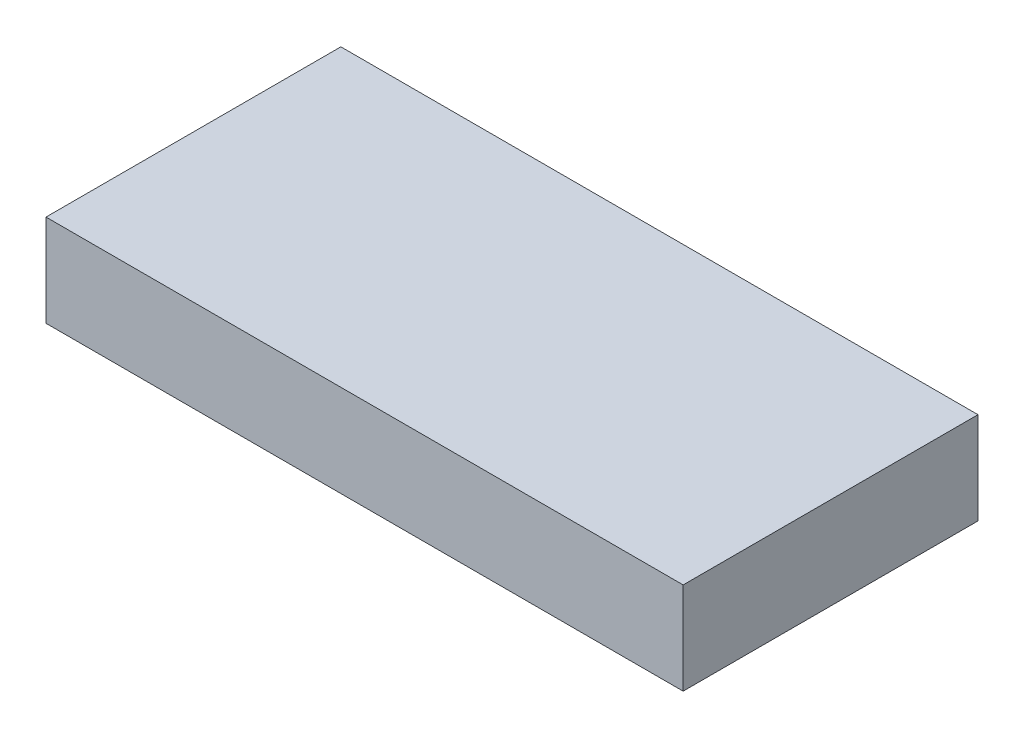
ISO-10303-21;
HEADER;
FILE_DESCRIPTION(('STEP AP214'),'2;1');
FILE_NAME('part.step','',(''),(''),'','','');
FILE_SCHEMA(('AUTOMOTIVE_DESIGN { 1 0 10303 214 1 1 1 1 }'));
ENDSEC;
DATA;
#1=APPLICATION_CONTEXT('core data for automotive mechanical design processes');
#2=APPLICATION_PROTOCOL_DEFINITION('international standard','automotive_design',2000,#1);
#3=PRODUCT_CONTEXT('',#1,'mechanical');
#4=PRODUCT('Part','Part','',(#3));
#5=PRODUCT_RELATED_PRODUCT_CATEGORY('part','',(#4));
#6=PRODUCT_DEFINITION_FORMATION('','',#4);
#7=PRODUCT_DEFINITION_CONTEXT('part definition',#1,'design');
#8=PRODUCT_DEFINITION('design','',#6,#7);
#9=PRODUCT_DEFINITION_SHAPE('','',#8);
#10=(LENGTH_UNIT() NAMED_UNIT(*) SI_UNIT(.MILLI.,.METRE.));
#11=(NAMED_UNIT(*) PLANE_ANGLE_UNIT() SI_UNIT($,.RADIAN.));
#12=(NAMED_UNIT(*) SI_UNIT($,.STERADIAN.) SOLID_ANGLE_UNIT());
#13=UNCERTAINTY_MEASURE_WITH_UNIT(LENGTH_MEASURE(1.E-05),#10,'distance_accuracy_value','');
#14=(GEOMETRIC_REPRESENTATION_CONTEXT(3) GLOBAL_UNCERTAINTY_ASSIGNED_CONTEXT((#13)) GLOBAL_UNIT_ASSIGNED_CONTEXT((#10,
#11,#12)) REPRESENTATION_CONTEXT('',''));
#15=CARTESIAN_POINT('',(0.,0.,0.));
#16=DIRECTION('',(0.,0.,1.));
#17=DIRECTION('',(1.,0.,0.));
#18=AXIS2_PLACEMENT_3D('',#15,#16,#17);
#19=CARTESIAN_POINT('',(0.,260.,0.));
#20=DIRECTION('',(1.,0.,0.));
#21=DIRECTION('',(0.,0.,-1.));
#22=AXIS2_PLACEMENT_3D('',#19,#20,#21);
#23=PLANE('',#22);
#24=DIRECTION('',(0.,0.,1.));
#25=VECTOR('',#24,1.);
#26=CARTESIAN_POINT('',(0.,0.,0.));
#27=LINE('',#26,#25);
#28=CARTESIAN_POINT('',(0.,0.,-833.));
#29=VERTEX_POINT('',#28);
#30=CARTESIAN_POINT('',(0.,0.,0.));
#31=VERTEX_POINT('',#30);
#32=EDGE_CURVE('E111',#29,#31,#27,.T.);
#33=ORIENTED_EDGE('',*,*,#32,.T.);
#34=DIRECTION('',(0.,-1.,0.));
#35=VECTOR('',#34,1.);
#36=CARTESIAN_POINT('',(0.,260.,0.));
#37=LINE('',#36,#35);
#38=CARTESIAN_POINT('',(0.,260.,0.));
#39=VERTEX_POINT('',#38);
#40=EDGE_CURVE('E11',#39,#31,#37,.T.);
#41=ORIENTED_EDGE('',*,*,#40,.F.);
#42=DIRECTION('',(0.,0.,1.));
#43=VECTOR('',#42,1.);
#44=CARTESIAN_POINT('',(0.,260.,0.));
#45=LINE('',#44,#43);
#46=CARTESIAN_POINT('',(0.,260.,-833.));
#47=VERTEX_POINT('',#46);
#48=EDGE_CURVE('E95',#47,#39,#45,.T.);
#49=ORIENTED_EDGE('',*,*,#48,.F.);
#50=DIRECTION('',(0.,-1.,0.));
#51=VECTOR('',#50,1.);
#52=CARTESIAN_POINT('',(0.,260.,-833.));
#53=LINE('',#52,#51);
#54=EDGE_CURVE('E107',#47,#29,#53,.T.);
#55=ORIENTED_EDGE('',*,*,#54,.T.);
#56=EDGE_LOOP('',(#33,#41,#49,#55));
#57=FACE_BOUND('',#56,.T.);
#58=ADVANCED_FACE('F43',(#57),#23,.F.);
#59=CARTESIAN_POINT('',(0.,260.,0.));
#60=DIRECTION('',(0.,0.,-1.));
#61=DIRECTION('',(-1.,0.,0.));
#62=AXIS2_PLACEMENT_3D('',#59,#60,#61);
#63=PLANE('',#62);
#64=DIRECTION('',(1.,0.,0.));
#65=VECTOR('',#64,1.);
#66=CARTESIAN_POINT('',(0.,0.,0.));
#67=LINE('',#66,#65);
#68=CARTESIAN_POINT('',(1800.,0.,0.));
#69=VERTEX_POINT('',#68);
#70=EDGE_CURVE('E100',#31,#69,#67,.T.);
#71=ORIENTED_EDGE('',*,*,#70,.T.);
#72=DIRECTION('',(0.,-1.,0.));
#73=VECTOR('',#72,1.);
#74=CARTESIAN_POINT('',(1800.,260.,0.));
#75=LINE('',#74,#73);
#76=CARTESIAN_POINT('',(1800.,260.,0.));
#77=VERTEX_POINT('',#76);
#78=EDGE_CURVE('E52',#77,#69,#75,.T.);
#79=ORIENTED_EDGE('',*,*,#78,.F.);
#80=DIRECTION('',(1.,0.,0.));
#81=VECTOR('',#80,1.);
#82=CARTESIAN_POINT('',(0.,260.,0.));
#83=LINE('',#82,#81);
#84=EDGE_CURVE('E90',#39,#77,#83,.T.);
#85=ORIENTED_EDGE('',*,*,#84,.F.);
#86=ORIENTED_EDGE('',*,*,#40,.T.);
#87=EDGE_LOOP('',(#71,#79,#85,#86));
#88=FACE_BOUND('',#87,.T.);
#89=ADVANCED_FACE('F99',(#88),#63,.F.);
#90=CARTESIAN_POINT('',(1800.,260.,0.));
#91=DIRECTION('',(-1.,0.,0.));
#92=DIRECTION('',(0.,0.,1.));
#93=AXIS2_PLACEMENT_3D('',#90,#91,#92);
#94=PLANE('',#93);
#95=DIRECTION('',(0.,0.,-1.));
#96=VECTOR('',#95,1.);
#97=CARTESIAN_POINT('',(1800.,0.,0.));
#98=LINE('',#97,#96);
#99=CARTESIAN_POINT('',(1800.,0.,-833.));
#100=VERTEX_POINT('',#99);
#101=EDGE_CURVE('E77',#69,#100,#98,.T.);
#102=ORIENTED_EDGE('',*,*,#101,.T.);
#103=DIRECTION('',(0.,-1.,0.));
#104=VECTOR('',#103,1.);
#105=CARTESIAN_POINT('',(1800.,260.,-833.));
#106=LINE('',#105,#104);
#107=CARTESIAN_POINT('',(1800.,260.,-833.));
#108=VERTEX_POINT('',#107);
#109=EDGE_CURVE('E102',#108,#100,#106,.T.);
#110=ORIENTED_EDGE('',*,*,#109,.F.);
#111=DIRECTION('',(0.,0.,-1.));
#112=VECTOR('',#111,1.);
#113=CARTESIAN_POINT('',(1800.,260.,0.));
#114=LINE('',#113,#112);
#115=EDGE_CURVE('E93',#77,#108,#114,.T.);
#116=ORIENTED_EDGE('',*,*,#115,.F.);
#117=ORIENTED_EDGE('',*,*,#78,.T.);
#118=EDGE_LOOP('',(#102,#110,#116,#117));
#119=FACE_BOUND('',#118,.T.);
#120=ADVANCED_FACE('F103',(#119),#94,.F.);
#121=CARTESIAN_POINT('',(0.,260.,-833.));
#122=DIRECTION('',(0.,0.,1.));
#123=DIRECTION('',(1.,0.,0.));
#124=AXIS2_PLACEMENT_3D('',#121,#122,#123);
#125=PLANE('',#124);
#126=DIRECTION('',(-1.,0.,0.));
#127=VECTOR('',#126,1.);
#128=CARTESIAN_POINT('',(0.,0.,-833.));
#129=LINE('',#128,#127);
#130=EDGE_CURVE('E83',#100,#29,#129,.T.);
#131=ORIENTED_EDGE('',*,*,#130,.T.);
#132=ORIENTED_EDGE('',*,*,#54,.F.);
#133=DIRECTION('',(-1.,0.,0.));
#134=VECTOR('',#133,1.);
#135=CARTESIAN_POINT('',(0.,260.,-833.));
#136=LINE('',#135,#134);
#137=EDGE_CURVE('E60',#108,#47,#136,.T.);
#138=ORIENTED_EDGE('',*,*,#137,.F.);
#139=ORIENTED_EDGE('',*,*,#109,.T.);
#140=EDGE_LOOP('',(#131,#132,#138,#139));
#141=FACE_BOUND('',#140,.T.);
#142=ADVANCED_FACE('F124',(#141),#125,.F.);
#143=CARTESIAN_POINT('',(0.,260.,0.));
#144=DIRECTION('',(0.,-1.,0.));
#145=DIRECTION('',(0.,0.,-1.));
#146=AXIS2_PLACEMENT_3D('',#143,#144,#145);
#147=PLANE('',#146);
#148=ORIENTED_EDGE('',*,*,#48,.T.);
#149=ORIENTED_EDGE('',*,*,#84,.T.);
#150=ORIENTED_EDGE('',*,*,#115,.T.);
#151=ORIENTED_EDGE('',*,*,#137,.T.);
#152=EDGE_LOOP('',(#148,#149,#150,#151));
#153=FACE_BOUND('',#152,.T.);
#154=ADVANCED_FACE('F91',(#153),#147,.F.);
#155=CARTESIAN_POINT('',(0.,0.,0.));
#156=DIRECTION('',(0.,-1.,0.));
#157=DIRECTION('',(0.,0.,-1.));
#158=AXIS2_PLACEMENT_3D('',#155,#156,#157);
#159=PLANE('',#158);
#160=ORIENTED_EDGE('',*,*,#32,.F.);
#161=ORIENTED_EDGE('',*,*,#130,.F.);
#162=ORIENTED_EDGE('',*,*,#101,.F.);
#163=ORIENTED_EDGE('',*,*,#70,.F.);
#164=EDGE_LOOP('',(#160,#161,#162,#163));
#165=FACE_BOUND('',#164,.T.);
#166=ADVANCED_FACE('F127',(#165),#159,.T.);
#167=CLOSED_SHELL('',(#58,#89,#120,#142,#154,#166));
#168=MANIFOLD_SOLID_BREP('B2',#167);
#169=ADVANCED_BREP_SHAPE_REPRESENTATION('',(#18,#168),#14);
#170=SHAPE_DEFINITION_REPRESENTATION(#9,#169);
ENDSEC;
END-ISO-10303-21;
